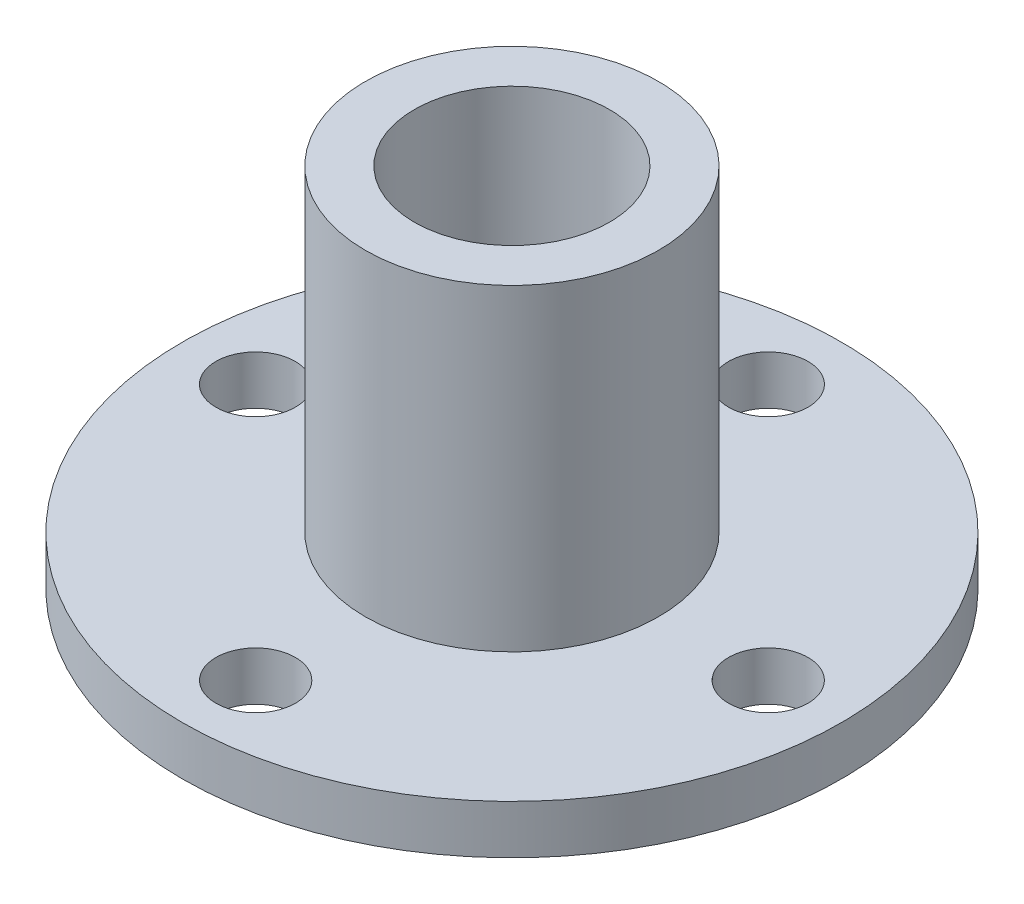
ISO-10303-21;
HEADER;
FILE_DESCRIPTION(('STEP AP214'),'2;1');
FILE_NAME('part.step','',(''),(''),'','','');
FILE_SCHEMA(('AUTOMOTIVE_DESIGN { 1 0 10303 214 1 1 1 1 }'));
ENDSEC;
DATA;
#1=APPLICATION_CONTEXT('core data for automotive mechanical design processes');
#2=APPLICATION_PROTOCOL_DEFINITION('international standard','automotive_design',2000,#1);
#3=PRODUCT_CONTEXT('',#1,'mechanical');
#4=PRODUCT('Part','Part','',(#3));
#5=PRODUCT_RELATED_PRODUCT_CATEGORY('part','',(#4));
#6=PRODUCT_DEFINITION_FORMATION('','',#4);
#7=PRODUCT_DEFINITION_CONTEXT('part definition',#1,'design');
#8=PRODUCT_DEFINITION('design','',#6,#7);
#9=PRODUCT_DEFINITION_SHAPE('','',#8);
#10=(LENGTH_UNIT() NAMED_UNIT(*) SI_UNIT(.MILLI.,.METRE.));
#11=(NAMED_UNIT(*) PLANE_ANGLE_UNIT() SI_UNIT($,.RADIAN.));
#12=(NAMED_UNIT(*) SI_UNIT($,.STERADIAN.) SOLID_ANGLE_UNIT());
#13=UNCERTAINTY_MEASURE_WITH_UNIT(LENGTH_MEASURE(1.E-05),#10,'distance_accuracy_value','');
#14=(GEOMETRIC_REPRESENTATION_CONTEXT(3) GLOBAL_UNCERTAINTY_ASSIGNED_CONTEXT((#13)) GLOBAL_UNIT_ASSIGNED_CONTEXT((#10,
#11,#12)) REPRESENTATION_CONTEXT('',''));
#15=CARTESIAN_POINT('',(0.,0.,0.));
#16=DIRECTION('',(0.,0.,1.));
#17=DIRECTION('',(1.,0.,0.));
#18=AXIS2_PLACEMENT_3D('',#15,#16,#17);
#19=CARTESIAN_POINT('',(0.,2.,0.));
#20=DIRECTION('',(0.,1.,0.));
#21=DIRECTION('',(0.,0.,1.));
#22=AXIS2_PLACEMENT_3D('',#19,#20,#21);
#23=PLANE('',#22);
#24=CARTESIAN_POINT('',(0.,2.,0.));
#25=DIRECTION('',(0.,1.,0.));
#26=DIRECTION('',(0.,0.,1.));
#27=AXIS2_PLACEMENT_3D('',#24,#25,#26);
#28=CIRCLE('',#27,13.5);
#29=CARTESIAN_POINT('',(0.,2.,13.5));
#30=VERTEX_POINT('',#29);
#31=EDGE_CURVE('E10',#30,#30,#28,.T.);
#32=ORIENTED_EDGE('',*,*,#31,.T.);
#33=EDGE_LOOP('',(#32));
#34=FACE_BOUND('',#33,.T.);
#35=CARTESIAN_POINT('',(0.,2.,-10.5010713739123));
#36=DIRECTION('',(0.,1.,0.));
#37=DIRECTION('',(0.,0.,1.));
#38=AXIS2_PLACEMENT_3D('',#35,#36,#37);
#39=CIRCLE('',#38,1.62716383447006);
#40=CARTESIAN_POINT('',(0.,2.,-8.87390753944222));
#41=VERTEX_POINT('',#40);
#42=EDGE_CURVE('E46',#41,#41,#39,.T.);
#43=ORIENTED_EDGE('',*,*,#42,.F.);
#44=EDGE_LOOP('',(#43));
#45=FACE_BOUND('',#44,.T.);
#46=CARTESIAN_POINT('',(10.5,2.,0.));
#47=DIRECTION('',(0.,1.,0.));
#48=DIRECTION('',(0.,0.,1.));
#49=AXIS2_PLACEMENT_3D('',#46,#47,#48);
#50=CIRCLE('',#49,1.62716383447006);
#51=CARTESIAN_POINT('',(10.5,2.,1.62716383447006));
#52=VERTEX_POINT('',#51);
#53=EDGE_CURVE('E51',#52,#52,#50,.T.);
#54=ORIENTED_EDGE('',*,*,#53,.F.);
#55=EDGE_LOOP('',(#54));
#56=FACE_BOUND('',#55,.T.);
#57=CARTESIAN_POINT('',(0.00214263850627228,2.,10.4989285167806));
#58=DIRECTION('',(0.,1.,0.));
#59=DIRECTION('',(0.,0.,1.));
#60=AXIS2_PLACEMENT_3D('',#57,#58,#59);
#61=CIRCLE('',#60,1.62716383447006);
#62=CARTESIAN_POINT('',(0.00214263850627228,2.,12.1260923512506));
#63=VERTEX_POINT('',#62);
#64=EDGE_CURVE('E76',#63,#63,#61,.T.);
#65=ORIENTED_EDGE('',*,*,#64,.F.);
#66=EDGE_LOOP('',(#65));
#67=FACE_BOUND('',#66,.T.);
#68=CARTESIAN_POINT('',(-10.5,2.,0.));
#69=DIRECTION('',(0.,1.,0.));
#70=DIRECTION('',(0.,0.,1.));
#71=AXIS2_PLACEMENT_3D('',#68,#69,#70);
#72=CIRCLE('',#71,1.62716383447006);
#73=CARTESIAN_POINT('',(-10.5,2.,1.62716383447007));
#74=VERTEX_POINT('',#73);
#75=EDGE_CURVE('E72',#74,#74,#72,.T.);
#76=ORIENTED_EDGE('',*,*,#75,.F.);
#77=EDGE_LOOP('',(#76));
#78=FACE_BOUND('',#77,.T.);
#79=CARTESIAN_POINT('',(0.,2.,0.));
#80=DIRECTION('',(0.,1.,0.));
#81=DIRECTION('',(0.,0.,1.));
#82=AXIS2_PLACEMENT_3D('',#79,#80,#81);
#83=CIRCLE('',#82,6.);
#84=CARTESIAN_POINT('',(0.,2.,6.));
#85=VERTEX_POINT('',#84);
#86=EDGE_CURVE('E59',#85,#85,#83,.F.);
#87=ORIENTED_EDGE('',*,*,#86,.T.);
#88=EDGE_LOOP('',(#87));
#89=FACE_BOUND('',#88,.T.);
#90=ADVANCED_FACE('F38',(#34,#45,#56,#67,#78,#89),#23,.T.);
#91=CARTESIAN_POINT('',(0.,2.,0.));
#92=DIRECTION('',(0.,-1.,0.));
#93=DIRECTION('',(0.,0.,-1.));
#94=AXIS2_PLACEMENT_3D('',#91,#92,#93);
#95=CYLINDRICAL_SURFACE('',#94,13.5);
#96=ORIENTED_EDGE('',*,*,#31,.F.);
#97=EDGE_LOOP('',(#96));
#98=FACE_BOUND('',#97,.T.);
#99=CARTESIAN_POINT('',(0.,0.,0.));
#100=DIRECTION('',(0.,1.,0.));
#101=DIRECTION('',(0.,0.,1.));
#102=AXIS2_PLACEMENT_3D('',#99,#100,#101);
#103=CIRCLE('',#102,13.5);
#104=CARTESIAN_POINT('',(0.,0.,13.5));
#105=VERTEX_POINT('',#104);
#106=EDGE_CURVE('E67',#105,#105,#103,.T.);
#107=ORIENTED_EDGE('',*,*,#106,.T.);
#108=EDGE_LOOP('',(#107));
#109=FACE_BOUND('',#108,.T.);
#110=ADVANCED_FACE('F92',(#98,#109),#95,.T.);
#111=CARTESIAN_POINT('',(0.,2.,-10.5010713739123));
#112=DIRECTION('',(0.,-1.,0.));
#113=DIRECTION('',(0.,0.,-1.));
#114=AXIS2_PLACEMENT_3D('',#111,#112,#113);
#115=CYLINDRICAL_SURFACE('',#114,1.62716383447006);
#116=ORIENTED_EDGE('',*,*,#42,.T.);
#117=EDGE_LOOP('',(#116));
#118=FACE_BOUND('',#117,.T.);
#119=CARTESIAN_POINT('',(0.,0.,-10.5010713739123));
#120=DIRECTION('',(0.,1.,0.));
#121=DIRECTION('',(0.,0.,1.));
#122=AXIS2_PLACEMENT_3D('',#119,#120,#121);
#123=CIRCLE('',#122,1.62716383447006);
#124=CARTESIAN_POINT('',(0.,0.,-8.87390753944222));
#125=VERTEX_POINT('',#124);
#126=EDGE_CURVE('E65',#125,#125,#123,.T.);
#127=ORIENTED_EDGE('',*,*,#126,.F.);
#128=EDGE_LOOP('',(#127));
#129=FACE_BOUND('',#128,.T.);
#130=ADVANCED_FACE('F128',(#118,#129),#115,.F.);
#131=CARTESIAN_POINT('',(10.5,2.,0.));
#132=DIRECTION('',(0.,-1.,0.));
#133=DIRECTION('',(0.,0.,-1.));
#134=AXIS2_PLACEMENT_3D('',#131,#132,#133);
#135=CYLINDRICAL_SURFACE('',#134,1.62716383447006);
#136=ORIENTED_EDGE('',*,*,#53,.T.);
#137=EDGE_LOOP('',(#136));
#138=FACE_BOUND('',#137,.T.);
#139=CARTESIAN_POINT('',(10.5,0.,0.));
#140=DIRECTION('',(0.,1.,0.));
#141=DIRECTION('',(0.,0.,1.));
#142=AXIS2_PLACEMENT_3D('',#139,#140,#141);
#143=CIRCLE('',#142,1.62716383447006);
#144=CARTESIAN_POINT('',(10.5,0.,1.62716383447006));
#145=VERTEX_POINT('',#144);
#146=EDGE_CURVE('E62',#145,#145,#143,.T.);
#147=ORIENTED_EDGE('',*,*,#146,.F.);
#148=EDGE_LOOP('',(#147));
#149=FACE_BOUND('',#148,.T.);
#150=ADVANCED_FACE('F87',(#138,#149),#135,.F.);
#151=CARTESIAN_POINT('',(0.00214263850627228,2.,10.4989285167806));
#152=DIRECTION('',(0.,-1.,0.));
#153=DIRECTION('',(0.,0.,-1.));
#154=AXIS2_PLACEMENT_3D('',#151,#152,#153);
#155=CYLINDRICAL_SURFACE('',#154,1.62716383447006);
#156=ORIENTED_EDGE('',*,*,#64,.T.);
#157=EDGE_LOOP('',(#156));
#158=FACE_BOUND('',#157,.T.);
#159=CARTESIAN_POINT('',(0.00214263850627228,0.,10.4989285167806));
#160=DIRECTION('',(0.,1.,0.));
#161=DIRECTION('',(0.,0.,1.));
#162=AXIS2_PLACEMENT_3D('',#159,#160,#161);
#163=CIRCLE('',#162,1.62716383447006);
#164=CARTESIAN_POINT('',(0.00214263850627228,0.,12.1260923512506));
#165=VERTEX_POINT('',#164);
#166=EDGE_CURVE('E58',#165,#165,#163,.T.);
#167=ORIENTED_EDGE('',*,*,#166,.F.);
#168=EDGE_LOOP('',(#167));
#169=FACE_BOUND('',#168,.T.);
#170=ADVANCED_FACE('F134',(#158,#169),#155,.F.);
#171=CARTESIAN_POINT('',(-10.5,2.,0.));
#172=DIRECTION('',(0.,-1.,0.));
#173=DIRECTION('',(0.,0.,-1.));
#174=AXIS2_PLACEMENT_3D('',#171,#172,#173);
#175=CYLINDRICAL_SURFACE('',#174,1.62716383447006);
#176=ORIENTED_EDGE('',*,*,#75,.T.);
#177=EDGE_LOOP('',(#176));
#178=FACE_BOUND('',#177,.T.);
#179=CARTESIAN_POINT('',(-10.5,0.,0.));
#180=DIRECTION('',(0.,1.,0.));
#181=DIRECTION('',(0.,0.,1.));
#182=AXIS2_PLACEMENT_3D('',#179,#180,#181);
#183=CIRCLE('',#182,1.62716383447006);
#184=CARTESIAN_POINT('',(-10.5,0.,1.62716383447007));
#185=VERTEX_POINT('',#184);
#186=EDGE_CURVE('E55',#185,#185,#183,.T.);
#187=ORIENTED_EDGE('',*,*,#186,.F.);
#188=EDGE_LOOP('',(#187));
#189=FACE_BOUND('',#188,.T.);
#190=ADVANCED_FACE('F40',(#178,#189),#175,.F.);
#191=CARTESIAN_POINT('',(0.,2.,0.));
#192=DIRECTION('',(0.,-1.,0.));
#193=DIRECTION('',(0.,0.,-1.));
#194=AXIS2_PLACEMENT_3D('',#191,#192,#193);
#195=CYLINDRICAL_SURFACE('',#194,4.);
#196=CARTESIAN_POINT('',(0.,0.,0.));
#197=DIRECTION('',(0.,1.,0.));
#198=DIRECTION('',(0.,0.,1.));
#199=AXIS2_PLACEMENT_3D('',#196,#197,#198);
#200=CIRCLE('',#199,4.);
#201=CARTESIAN_POINT('',(0.,0.,4.));
#202=VERTEX_POINT('',#201);
#203=EDGE_CURVE('E42',#202,#202,#200,.T.);
#204=ORIENTED_EDGE('',*,*,#203,.F.);
#205=EDGE_LOOP('',(#204));
#206=FACE_BOUND('',#205,.T.);
#207=CARTESIAN_POINT('',(0.,15.,0.));
#208=DIRECTION('',(0.,1.,0.));
#209=DIRECTION('',(0.,0.,1.));
#210=AXIS2_PLACEMENT_3D('',#207,#208,#209);
#211=CIRCLE('',#210,4.);
#212=CARTESIAN_POINT('',(0.,15.,4.));
#213=VERTEX_POINT('',#212);
#214=EDGE_CURVE('E102',#213,#213,#211,.T.);
#215=ORIENTED_EDGE('',*,*,#214,.T.);
#216=EDGE_LOOP('',(#215));
#217=FACE_BOUND('',#216,.T.);
#218=ADVANCED_FACE('F109',(#206,#217),#195,.F.);
#219=CARTESIAN_POINT('',(0.,0.,0.));
#220=DIRECTION('',(0.,1.,0.));
#221=DIRECTION('',(0.,0.,1.));
#222=AXIS2_PLACEMENT_3D('',#219,#220,#221);
#223=PLANE('',#222);
#224=ORIENTED_EDGE('',*,*,#203,.T.);
#225=EDGE_LOOP('',(#224));
#226=FACE_BOUND('',#225,.T.);
#227=ORIENTED_EDGE('',*,*,#106,.F.);
#228=EDGE_LOOP('',(#227));
#229=FACE_BOUND('',#228,.T.);
#230=ORIENTED_EDGE('',*,*,#126,.T.);
#231=EDGE_LOOP('',(#230));
#232=FACE_BOUND('',#231,.T.);
#233=ORIENTED_EDGE('',*,*,#146,.T.);
#234=EDGE_LOOP('',(#233));
#235=FACE_BOUND('',#234,.T.);
#236=ORIENTED_EDGE('',*,*,#166,.T.);
#237=EDGE_LOOP('',(#236));
#238=FACE_BOUND('',#237,.T.);
#239=ORIENTED_EDGE('',*,*,#186,.T.);
#240=EDGE_LOOP('',(#239));
#241=FACE_BOUND('',#240,.T.);
#242=ADVANCED_FACE('F114',(#226,#229,#232,#235,#238,#241),#223,.F.);
#243=CARTESIAN_POINT('',(0.,15.,0.));
#244=DIRECTION('',(0.,1.,0.));
#245=DIRECTION('',(0.,0.,1.));
#246=AXIS2_PLACEMENT_3D('',#243,#244,#245);
#247=PLANE('',#246);
#248=CARTESIAN_POINT('',(0.,15.,0.));
#249=DIRECTION('',(0.,1.,0.));
#250=DIRECTION('',(0.,0.,1.));
#251=AXIS2_PLACEMENT_3D('',#248,#249,#250);
#252=CIRCLE('',#251,6.);
#253=CARTESIAN_POINT('',(0.,15.,6.));
#254=VERTEX_POINT('',#253);
#255=EDGE_CURVE('E100',#254,#254,#252,.T.);
#256=ORIENTED_EDGE('',*,*,#255,.T.);
#257=EDGE_LOOP('',(#256));
#258=FACE_BOUND('',#257,.T.);
#259=ORIENTED_EDGE('',*,*,#214,.F.);
#260=EDGE_LOOP('',(#259));
#261=FACE_BOUND('',#260,.T.);
#262=ADVANCED_FACE('F111',(#258,#261),#247,.T.);
#263=CARTESIAN_POINT('',(0.,15.,0.));
#264=DIRECTION('',(0.,-1.,0.));
#265=DIRECTION('',(0.,0.,-1.));
#266=AXIS2_PLACEMENT_3D('',#263,#264,#265);
#267=CYLINDRICAL_SURFACE('',#266,6.);
#268=ORIENTED_EDGE('',*,*,#86,.F.);
#269=EDGE_LOOP('',(#268));
#270=FACE_BOUND('',#269,.T.);
#271=ORIENTED_EDGE('',*,*,#255,.F.);
#272=EDGE_LOOP('',(#271));
#273=FACE_BOUND('',#272,.T.);
#274=ADVANCED_FACE('F113',(#270,#273),#267,.T.);
#275=CLOSED_SHELL('',(#90,#110,#130,#150,#170,#190,#218,#242,#262,#274));
#276=MANIFOLD_SOLID_BREP('B2',#275);
#277=ADVANCED_BREP_SHAPE_REPRESENTATION('',(#18,#276),#14);
#278=SHAPE_DEFINITION_REPRESENTATION(#9,#277);
ENDSEC;
END-ISO-10303-21;
